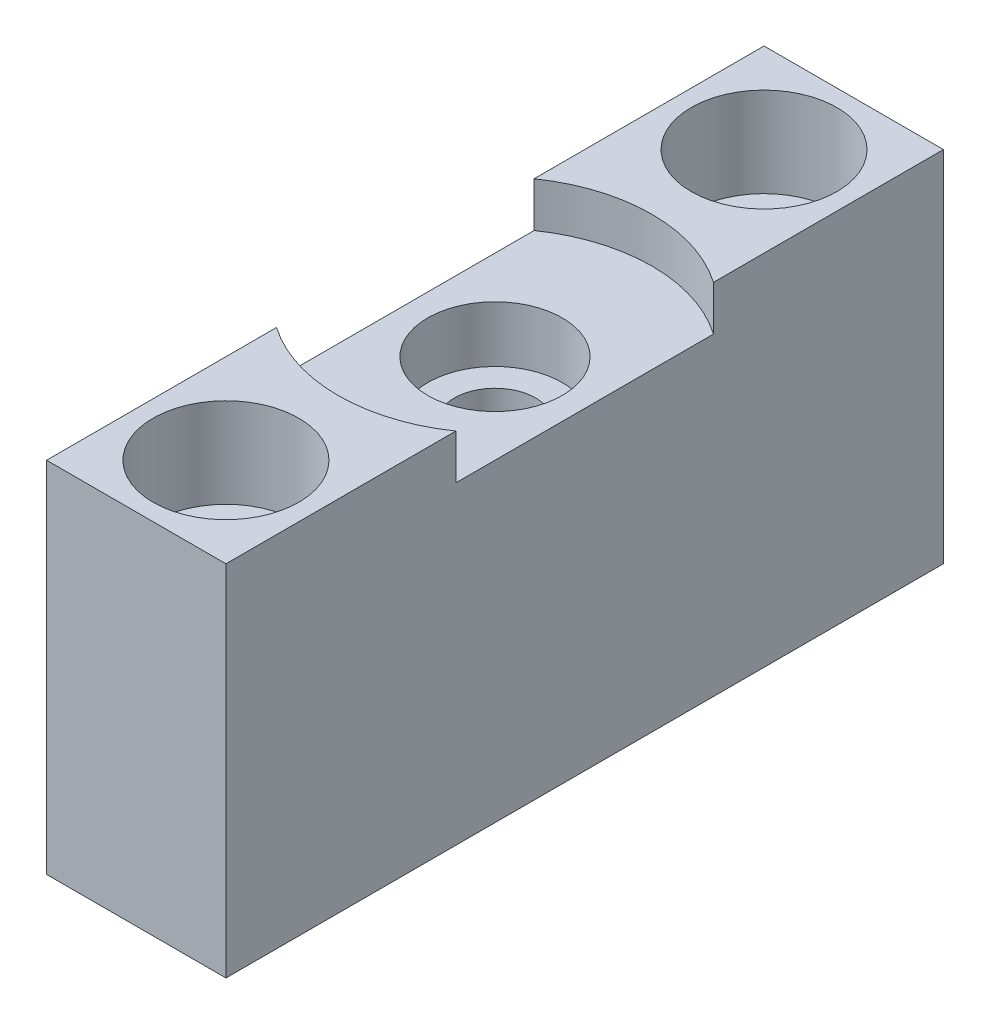
ISO-10303-21;
HEADER;
FILE_DESCRIPTION(('STEP AP214'),'2;1');
FILE_NAME('part.step','',(''),(''),'','','');
FILE_SCHEMA(('AUTOMOTIVE_DESIGN { 1 0 10303 214 1 1 1 1 }'));
ENDSEC;
DATA;
#1=APPLICATION_CONTEXT('core data for automotive mechanical design processes');
#2=APPLICATION_PROTOCOL_DEFINITION('international standard','automotive_design',2000,#1);
#3=PRODUCT_CONTEXT('',#1,'mechanical');
#4=PRODUCT('Part','Part','',(#3));
#5=PRODUCT_RELATED_PRODUCT_CATEGORY('part','',(#4));
#6=PRODUCT_DEFINITION_FORMATION('','',#4);
#7=PRODUCT_DEFINITION_CONTEXT('part definition',#1,'design');
#8=PRODUCT_DEFINITION('design','',#6,#7);
#9=PRODUCT_DEFINITION_SHAPE('','',#8);
#10=(LENGTH_UNIT() NAMED_UNIT(*) SI_UNIT(.MILLI.,.METRE.));
#11=(NAMED_UNIT(*) PLANE_ANGLE_UNIT() SI_UNIT($,.RADIAN.));
#12=(NAMED_UNIT(*) SI_UNIT($,.STERADIAN.) SOLID_ANGLE_UNIT());
#13=UNCERTAINTY_MEASURE_WITH_UNIT(LENGTH_MEASURE(1.E-05),#10,'distance_accuracy_value','');
#14=(GEOMETRIC_REPRESENTATION_CONTEXT(3) GLOBAL_UNCERTAINTY_ASSIGNED_CONTEXT((#13)) GLOBAL_UNIT_ASSIGNED_CONTEXT((#10,
#11,#12)) REPRESENTATION_CONTEXT('',''));
#15=CARTESIAN_POINT('',(0.,0.,0.));
#16=DIRECTION('',(0.,0.,1.));
#17=DIRECTION('',(1.,0.,0.));
#18=AXIS2_PLACEMENT_3D('',#15,#16,#17);
#19=CARTESIAN_POINT('',(25.4,50.8,0.));
#20=DIRECTION('',(0.,-1.,0.));
#21=DIRECTION('',(0.,0.,-1.));
#22=AXIS2_PLACEMENT_3D('',#19,#20,#21);
#23=PLANE('',#22);
#24=CARTESIAN_POINT('',(12.7,50.8,-12.7));
#25=DIRECTION('',(0.,1.,0.));
#26=DIRECTION('',(0.,0.,1.));
#27=AXIS2_PLACEMENT_3D('',#24,#25,#26);
#28=CIRCLE('',#27,10.31875);
#29=CARTESIAN_POINT('',(12.7,50.8,-2.38124999999999));
#30=VERTEX_POINT('',#29);
#31=EDGE_CURVE('E217',#30,#30,#28,.T.);
#32=ORIENTED_EDGE('',*,*,#31,.F.);
#33=EDGE_LOOP('',(#32));
#34=FACE_BOUND('',#33,.T.);
#35=DIRECTION('',(0.,0.,1.));
#36=VECTOR('',#35,1.);
#37=CARTESIAN_POINT('',(25.4,50.8,0.));
#38=LINE('',#37,#36);
#39=CARTESIAN_POINT('',(25.4,50.8,-32.5610135972417));
#40=VERTEX_POINT('',#39);
#41=CARTESIAN_POINT('',(25.4,50.8,0.));
#42=VERTEX_POINT('',#41);
#43=EDGE_CURVE('E59',#40,#42,#38,.T.);
#44=ORIENTED_EDGE('',*,*,#43,.F.);
#45=CARTESIAN_POINT('',(12.7,50.8,-50.8));
#46=DIRECTION('',(0.,1.,0.));
#47=DIRECTION('',(0.,0.,1.));
#48=AXIS2_PLACEMENT_3D('',#45,#46,#47);
#49=CIRCLE('',#48,22.225);
#50=CARTESIAN_POINT('',(0.,50.8,-32.5610135972417));
#51=VERTEX_POINT('',#50);
#52=EDGE_CURVE('E108',#51,#40,#49,.T.);
#53=ORIENTED_EDGE('',*,*,#52,.F.);
#54=DIRECTION('',(0.,0.,1.));
#55=VECTOR('',#54,1.);
#56=CARTESIAN_POINT('',(0.,50.8,0.));
#57=LINE('',#56,#55);
#58=CARTESIAN_POINT('',(0.,50.8,0.));
#59=VERTEX_POINT('',#58);
#60=EDGE_CURVE('E81',#51,#59,#57,.T.);
#61=ORIENTED_EDGE('',*,*,#60,.T.);
#62=DIRECTION('',(-1.,0.,0.));
#63=VECTOR('',#62,1.);
#64=CARTESIAN_POINT('',(25.4,50.8,0.));
#65=LINE('',#64,#63);
#66=EDGE_CURVE('E124',#42,#59,#65,.T.);
#67=ORIENTED_EDGE('',*,*,#66,.F.);
#68=EDGE_LOOP('',(#44,#53,#61,#67));
#69=FACE_BOUND('',#68,.T.);
#70=ADVANCED_FACE('F35',(#34,#69),#23,.F.);
#71=CARTESIAN_POINT('',(25.4,0.,0.));
#72=DIRECTION('',(0.,0.,-1.));
#73=DIRECTION('',(-1.,0.,0.));
#74=AXIS2_PLACEMENT_3D('',#71,#72,#73);
#75=PLANE('',#74);
#76=DIRECTION('',(0.,-1.,0.));
#77=VECTOR('',#76,1.);
#78=CARTESIAN_POINT('',(0.,0.,0.));
#79=LINE('',#78,#77);
#80=CARTESIAN_POINT('',(0.,0.,0.));
#81=VERTEX_POINT('',#80);
#82=EDGE_CURVE('E121',#59,#81,#79,.T.);
#83=ORIENTED_EDGE('',*,*,#82,.T.);
#84=DIRECTION('',(-1.,0.,0.));
#85=VECTOR('',#84,1.);
#86=CARTESIAN_POINT('',(25.4,0.,0.));
#87=LINE('',#86,#85);
#88=CARTESIAN_POINT('',(25.4,0.,0.));
#89=VERTEX_POINT('',#88);
#90=EDGE_CURVE('E150',#89,#81,#87,.T.);
#91=ORIENTED_EDGE('',*,*,#90,.F.);
#92=DIRECTION('',(0.,-1.,0.));
#93=VECTOR('',#92,1.);
#94=CARTESIAN_POINT('',(25.4,0.,0.));
#95=LINE('',#94,#93);
#96=EDGE_CURVE('E142',#42,#89,#95,.T.);
#97=ORIENTED_EDGE('',*,*,#96,.F.);
#98=ORIENTED_EDGE('',*,*,#66,.T.);
#99=EDGE_LOOP('',(#83,#91,#97,#98));
#100=FACE_BOUND('',#99,.T.);
#101=ADVANCED_FACE('F37',(#100),#75,.F.);
#102=CARTESIAN_POINT('',(25.4,0.,0.));
#103=DIRECTION('',(0.,1.,0.));
#104=DIRECTION('',(0.,0.,1.));
#105=AXIS2_PLACEMENT_3D('',#102,#103,#104);
#106=PLANE('',#105);
#107=CARTESIAN_POINT('',(12.7,0.,-88.9));
#108=DIRECTION('',(0.,1.,0.));
#109=DIRECTION('',(0.,0.,1.));
#110=AXIS2_PLACEMENT_3D('',#107,#108,#109);
#111=CIRCLE('',#110,6.74624000000007);
#112=CARTESIAN_POINT('',(12.7,0.,-82.1537599999999));
#113=VERTEX_POINT('',#112);
#114=EDGE_CURVE('E214',#113,#113,#111,.T.);
#115=ORIENTED_EDGE('',*,*,#114,.T.);
#116=EDGE_LOOP('',(#115));
#117=FACE_BOUND('',#116,.T.);
#118=CARTESIAN_POINT('',(12.7,0.,-12.7));
#119=DIRECTION('',(0.,1.,0.));
#120=DIRECTION('',(0.,0.,1.));
#121=AXIS2_PLACEMENT_3D('',#118,#119,#120);
#122=CIRCLE('',#121,6.74624000000007);
#123=CARTESIAN_POINT('',(12.7,0.,-5.95375999999992));
#124=VERTEX_POINT('',#123);
#125=EDGE_CURVE('E226',#124,#124,#122,.T.);
#126=ORIENTED_EDGE('',*,*,#125,.T.);
#127=EDGE_LOOP('',(#126));
#128=FACE_BOUND('',#127,.T.);
#129=CARTESIAN_POINT('',(12.7,0.,-50.8));
#130=DIRECTION('',(0.,1.,0.));
#131=DIRECTION('',(0.,0.,1.));
#132=AXIS2_PLACEMENT_3D('',#129,#130,#131);
#133=CIRCLE('',#132,5.7543699999999);
#134=CARTESIAN_POINT('',(12.7,0.,-45.0456300000001));
#135=VERTEX_POINT('',#134);
#136=EDGE_CURVE('E232',#135,#135,#133,.T.);
#137=ORIENTED_EDGE('',*,*,#136,.T.);
#138=EDGE_LOOP('',(#137));
#139=FACE_BOUND('',#138,.T.);
#140=DIRECTION('',(0.,0.,-1.));
#141=VECTOR('',#140,1.);
#142=CARTESIAN_POINT('',(0.,0.,0.));
#143=LINE('',#142,#141);
#144=CARTESIAN_POINT('',(0.,0.,-101.6));
#145=VERTEX_POINT('',#144);
#146=EDGE_CURVE('E135',#81,#145,#143,.T.);
#147=ORIENTED_EDGE('',*,*,#146,.T.);
#148=DIRECTION('',(-1.,0.,0.));
#149=VECTOR('',#148,1.);
#150=CARTESIAN_POINT('',(25.4,0.,-101.6));
#151=LINE('',#150,#149);
#152=CARTESIAN_POINT('',(25.4,0.,-101.6));
#153=VERTEX_POINT('',#152);
#154=EDGE_CURVE('E147',#153,#145,#151,.T.);
#155=ORIENTED_EDGE('',*,*,#154,.F.);
#156=DIRECTION('',(0.,0.,-1.));
#157=VECTOR('',#156,1.);
#158=CARTESIAN_POINT('',(25.4,0.,0.));
#159=LINE('',#158,#157);
#160=EDGE_CURVE('E89',#89,#153,#159,.T.);
#161=ORIENTED_EDGE('',*,*,#160,.F.);
#162=ORIENTED_EDGE('',*,*,#90,.T.);
#163=EDGE_LOOP('',(#147,#155,#161,#162));
#164=FACE_BOUND('',#163,.T.);
#165=ADVANCED_FACE('F173',(#117,#128,#139,#164),#106,.F.);
#166=CARTESIAN_POINT('',(25.4,0.,-101.6));
#167=DIRECTION('',(0.,0.,1.));
#168=DIRECTION('',(1.,0.,0.));
#169=AXIS2_PLACEMENT_3D('',#166,#167,#168);
#170=PLANE('',#169);
#171=DIRECTION('',(0.,1.,0.));
#172=VECTOR('',#171,1.);
#173=CARTESIAN_POINT('',(0.,0.,-101.6));
#174=LINE('',#173,#172);
#175=CARTESIAN_POINT('',(0.,50.8,-101.6));
#176=VERTEX_POINT('',#175);
#177=EDGE_CURVE('E137',#145,#176,#174,.T.);
#178=ORIENTED_EDGE('',*,*,#177,.T.);
#179=DIRECTION('',(-1.,0.,0.));
#180=VECTOR('',#179,1.);
#181=CARTESIAN_POINT('',(25.4,50.8,-101.6));
#182=LINE('',#181,#180);
#183=CARTESIAN_POINT('',(25.4,50.8,-101.6));
#184=VERTEX_POINT('',#183);
#185=EDGE_CURVE('E144',#184,#176,#182,.T.);
#186=ORIENTED_EDGE('',*,*,#185,.F.);
#187=DIRECTION('',(0.,1.,0.));
#188=VECTOR('',#187,1.);
#189=CARTESIAN_POINT('',(25.4,0.,-101.6));
#190=LINE('',#189,#188);
#191=EDGE_CURVE('E127',#153,#184,#190,.T.);
#192=ORIENTED_EDGE('',*,*,#191,.F.);
#193=ORIENTED_EDGE('',*,*,#154,.T.);
#194=EDGE_LOOP('',(#178,#186,#192,#193));
#195=FACE_BOUND('',#194,.T.);
#196=ADVANCED_FACE('F176',(#195),#170,.F.);
#197=CARTESIAN_POINT('',(12.7,50.8,-88.9));
#198=DIRECTION('',(0.,1.,0.));
#199=DIRECTION('',(0.,0.,1.));
#200=AXIS2_PLACEMENT_3D('',#197,#198,#199);
#201=CIRCLE('',#200,10.31875);
#202=CARTESIAN_POINT('',(12.7,50.8,-78.58125));
#203=VERTEX_POINT('',#202);
#204=EDGE_CURVE('E204',#203,#203,#201,.T.);
#205=ORIENTED_EDGE('',*,*,#204,.F.);
#206=EDGE_LOOP('',(#205));
#207=FACE_BOUND('',#206,.T.);
#208=CARTESIAN_POINT('',(0.,50.8,-69.0389864027582));
#209=VERTEX_POINT('',#208);
#210=EDGE_CURVE('E139',#176,#209,#57,.T.);
#211=ORIENTED_EDGE('',*,*,#210,.T.);
#212=CARTESIAN_POINT('',(25.4,50.8,-69.0389864027582));
#213=VERTEX_POINT('',#212);
#214=EDGE_CURVE('E114',#213,#209,#49,.T.);
#215=ORIENTED_EDGE('',*,*,#214,.F.);
#216=EDGE_CURVE('E126',#184,#213,#38,.T.);
#217=ORIENTED_EDGE('',*,*,#216,.F.);
#218=ORIENTED_EDGE('',*,*,#185,.T.);
#219=EDGE_LOOP('',(#211,#215,#217,#218));
#220=FACE_BOUND('',#219,.T.);
#221=ADVANCED_FACE('F179',(#207,#220),#23,.F.);
#222=CARTESIAN_POINT('',(25.4,0.,0.));
#223=DIRECTION('',(-1.,0.,0.));
#224=DIRECTION('',(0.,0.,1.));
#225=AXIS2_PLACEMENT_3D('',#222,#223,#224);
#226=PLANE('',#225);
#227=DIRECTION('',(0.,0.,-1.));
#228=VECTOR('',#227,1.);
#229=CARTESIAN_POINT('',(25.4,44.45,0.));
#230=LINE('',#229,#228);
#231=CARTESIAN_POINT('',(25.4,44.45,-32.5610135972417));
#232=VERTEX_POINT('',#231);
#233=CARTESIAN_POINT('',(25.4,44.45,-69.0389864027582));
#234=VERTEX_POINT('',#233);
#235=EDGE_CURVE('E120',#232,#234,#230,.T.);
#236=ORIENTED_EDGE('',*,*,#235,.F.);
#237=DIRECTION('',(0.,1.,0.));
#238=VECTOR('',#237,1.);
#239=CARTESIAN_POINT('',(25.4,44.45,-32.5610135972417));
#240=LINE('',#239,#238);
#241=EDGE_CURVE('E111',#232,#40,#240,.T.);
#242=ORIENTED_EDGE('',*,*,#241,.T.);
#243=ORIENTED_EDGE('',*,*,#43,.T.);
#244=ORIENTED_EDGE('',*,*,#96,.T.);
#245=ORIENTED_EDGE('',*,*,#160,.T.);
#246=ORIENTED_EDGE('',*,*,#191,.T.);
#247=ORIENTED_EDGE('',*,*,#216,.T.);
#248=DIRECTION('',(0.,1.,0.));
#249=VECTOR('',#248,1.);
#250=CARTESIAN_POINT('',(25.4,44.45,-69.0389864027582));
#251=LINE('',#250,#249);
#252=EDGE_CURVE('E122',#213,#234,#251,.F.);
#253=ORIENTED_EDGE('',*,*,#252,.T.);
#254=EDGE_LOOP('',(#236,#242,#243,#244,#245,#246,#247,#253));
#255=FACE_BOUND('',#254,.T.);
#256=ADVANCED_FACE('F118',(#255),#226,.F.);
#257=CARTESIAN_POINT('',(0.,0.,0.));
#258=DIRECTION('',(-1.,0.,0.));
#259=DIRECTION('',(0.,0.,1.));
#260=AXIS2_PLACEMENT_3D('',#257,#258,#259);
#261=PLANE('',#260);
#262=DIRECTION('',(0.,1.,0.));
#263=VECTOR('',#262,1.);
#264=CARTESIAN_POINT('',(0.,44.45,-32.5610135972417));
#265=LINE('',#264,#263);
#266=CARTESIAN_POINT('',(0.,44.45,-32.5610135972417));
#267=VERTEX_POINT('',#266);
#268=EDGE_CURVE('E11',#267,#51,#265,.T.);
#269=ORIENTED_EDGE('',*,*,#268,.F.);
#270=DIRECTION('',(0.,0.,-1.));
#271=VECTOR('',#270,1.);
#272=CARTESIAN_POINT('',(0.,44.45,0.));
#273=LINE('',#272,#271);
#274=CARTESIAN_POINT('',(0.,44.45,-69.0389864027582));
#275=VERTEX_POINT('',#274);
#276=EDGE_CURVE('E152',#267,#275,#273,.T.);
#277=ORIENTED_EDGE('',*,*,#276,.T.);
#278=DIRECTION('',(0.,1.,0.));
#279=VECTOR('',#278,1.);
#280=CARTESIAN_POINT('',(0.,44.45,-69.0389864027582));
#281=LINE('',#280,#279);
#282=EDGE_CURVE('E43',#209,#275,#281,.F.);
#283=ORIENTED_EDGE('',*,*,#282,.F.);
#284=ORIENTED_EDGE('',*,*,#210,.F.);
#285=ORIENTED_EDGE('',*,*,#177,.F.);
#286=ORIENTED_EDGE('',*,*,#146,.F.);
#287=ORIENTED_EDGE('',*,*,#82,.F.);
#288=ORIENTED_EDGE('',*,*,#60,.F.);
#289=EDGE_LOOP('',(#269,#277,#283,#284,#285,#286,#287,#288));
#290=FACE_BOUND('',#289,.T.);
#291=ADVANCED_FACE('F160',(#290),#261,.T.);
#292=CARTESIAN_POINT('',(12.7,44.45,-50.8));
#293=DIRECTION('',(0.,1.,0.));
#294=DIRECTION('',(0.,0.,1.));
#295=AXIS2_PLACEMENT_3D('',#292,#293,#294);
#296=CYLINDRICAL_SURFACE('',#295,22.225);
#297=CARTESIAN_POINT('',(12.7,44.45,-50.8));
#298=DIRECTION('',(0.,1.,0.));
#299=DIRECTION('',(0.,0.,1.));
#300=AXIS2_PLACEMENT_3D('',#297,#298,#299);
#301=CIRCLE('',#300,22.225);
#302=EDGE_CURVE('E162',#267,#232,#301,.T.);
#303=ORIENTED_EDGE('',*,*,#302,.F.);
#304=ORIENTED_EDGE('',*,*,#268,.T.);
#305=ORIENTED_EDGE('',*,*,#52,.T.);
#306=ORIENTED_EDGE('',*,*,#241,.F.);
#307=EDGE_LOOP('',(#303,#304,#305,#306));
#308=FACE_BOUND('',#307,.T.);
#309=ADVANCED_FACE('F110',(#308),#296,.F.);
#310=ORIENTED_EDGE('',*,*,#214,.T.);
#311=ORIENTED_EDGE('',*,*,#282,.T.);
#312=EDGE_CURVE('E50',#234,#275,#301,.T.);
#313=ORIENTED_EDGE('',*,*,#312,.F.);
#314=ORIENTED_EDGE('',*,*,#252,.F.);
#315=EDGE_LOOP('',(#310,#311,#313,#314));
#316=FACE_BOUND('',#315,.T.);
#317=ADVANCED_FACE('F156',(#316),#296,.F.);
#318=CARTESIAN_POINT('',(12.7,44.45,-50.8));
#319=DIRECTION('',(0.,1.,0.));
#320=DIRECTION('',(0.,0.,1.));
#321=AXIS2_PLACEMENT_3D('',#318,#319,#320);
#322=PLANE('',#321);
#323=CARTESIAN_POINT('',(12.7,44.45,-50.8));
#324=DIRECTION('',(0.,1.,0.));
#325=DIRECTION('',(0.,0.,1.));
#326=AXIS2_PLACEMENT_3D('',#323,#324,#325);
#327=CIRCLE('',#326,9.525);
#328=CARTESIAN_POINT('',(12.7,44.45,-41.275));
#329=VERTEX_POINT('',#328);
#330=EDGE_CURVE('E165',#329,#329,#327,.T.);
#331=ORIENTED_EDGE('',*,*,#330,.F.);
#332=EDGE_LOOP('',(#331));
#333=FACE_BOUND('',#332,.T.);
#334=ORIENTED_EDGE('',*,*,#235,.T.);
#335=ORIENTED_EDGE('',*,*,#312,.T.);
#336=ORIENTED_EDGE('',*,*,#276,.F.);
#337=ORIENTED_EDGE('',*,*,#302,.T.);
#338=EDGE_LOOP('',(#334,#335,#336,#337));
#339=FACE_BOUND('',#338,.T.);
#340=ADVANCED_FACE('F161',(#333,#339),#322,.T.);
#341=CARTESIAN_POINT('',(12.7,36.5125,-50.8));
#342=DIRECTION('',(0.,1.,0.));
#343=DIRECTION('',(0.,0.,1.));
#344=AXIS2_PLACEMENT_3D('',#341,#342,#343);
#345=CYLINDRICAL_SURFACE('',#344,9.525);
#346=CARTESIAN_POINT('',(12.7,36.5125,-50.8));
#347=DIRECTION('',(0.,1.,0.));
#348=DIRECTION('',(0.,0.,1.));
#349=AXIS2_PLACEMENT_3D('',#346,#347,#348);
#350=CIRCLE('',#349,9.525);
#351=CARTESIAN_POINT('',(12.7,36.5125,-41.275));
#352=VERTEX_POINT('',#351);
#353=EDGE_CURVE('E115',#352,#352,#350,.T.);
#354=ORIENTED_EDGE('',*,*,#353,.F.);
#355=EDGE_LOOP('',(#354));
#356=FACE_BOUND('',#355,.T.);
#357=ORIENTED_EDGE('',*,*,#330,.T.);
#358=EDGE_LOOP('',(#357));
#359=FACE_BOUND('',#358,.T.);
#360=ADVANCED_FACE('F240',(#356,#359),#345,.F.);
#361=CARTESIAN_POINT('',(12.7,36.5125,-50.8));
#362=DIRECTION('',(0.,1.,0.));
#363=DIRECTION('',(0.,0.,1.));
#364=AXIS2_PLACEMENT_3D('',#361,#362,#363);
#365=PLANE('',#364);
#366=CARTESIAN_POINT('',(12.7,36.5125,-50.8));
#367=DIRECTION('',(0.,1.,0.));
#368=DIRECTION('',(0.,0.,1.));
#369=AXIS2_PLACEMENT_3D('',#366,#367,#368);
#370=CIRCLE('',#369,5.75436999999991);
#371=CARTESIAN_POINT('',(12.7,36.5125,-45.0456300000001));
#372=VERTEX_POINT('',#371);
#373=EDGE_CURVE('E229',#372,#372,#370,.T.);
#374=ORIENTED_EDGE('',*,*,#373,.F.);
#375=EDGE_LOOP('',(#374));
#376=FACE_BOUND('',#375,.T.);
#377=ORIENTED_EDGE('',*,*,#353,.T.);
#378=EDGE_LOOP('',(#377));
#379=FACE_BOUND('',#378,.T.);
#380=ADVANCED_FACE('F248',(#376,#379),#365,.T.);
#381=CARTESIAN_POINT('',(12.7,36.5125,-50.8));
#382=DIRECTION('',(0.,1.,0.));
#383=DIRECTION('',(0.,0.,1.));
#384=AXIS2_PLACEMENT_3D('',#381,#382,#383);
#385=CYLINDRICAL_SURFACE('',#384,5.7543699999999);
#386=ORIENTED_EDGE('',*,*,#136,.F.);
#387=EDGE_LOOP('',(#386));
#388=FACE_BOUND('',#387,.T.);
#389=ORIENTED_EDGE('',*,*,#373,.T.);
#390=EDGE_LOOP('',(#389));
#391=FACE_BOUND('',#390,.T.);
#392=ADVANCED_FACE('F286',(#388,#391),#385,.F.);
#393=CARTESIAN_POINT('',(12.7,50.8,-12.7));
#394=DIRECTION('',(0.,1.,0.));
#395=DIRECTION('',(0.,0.,1.));
#396=AXIS2_PLACEMENT_3D('',#393,#394,#395);
#397=CYLINDRICAL_SURFACE('',#396,6.74624000000008);
#398=ORIENTED_EDGE('',*,*,#125,.F.);
#399=EDGE_LOOP('',(#398));
#400=FACE_BOUND('',#399,.T.);
#401=CARTESIAN_POINT('',(12.7,38.1,-12.7));
#402=DIRECTION('',(0.,1.,0.));
#403=DIRECTION('',(0.,0.,1.));
#404=AXIS2_PLACEMENT_3D('',#401,#402,#403);
#405=CIRCLE('',#404,6.74624000000009);
#406=CARTESIAN_POINT('',(12.7,38.1,-5.95375999999991));
#407=VERTEX_POINT('',#406);
#408=EDGE_CURVE('E223',#407,#407,#405,.T.);
#409=ORIENTED_EDGE('',*,*,#408,.T.);
#410=EDGE_LOOP('',(#409));
#411=FACE_BOUND('',#410,.T.);
#412=ADVANCED_FACE('F295',(#400,#411),#397,.F.);
#413=CARTESIAN_POINT('',(19.4462400000001,38.1,-12.7));
#414=DIRECTION('',(0.,-1.,0.));
#415=DIRECTION('',(0.,0.,-1.));
#416=AXIS2_PLACEMENT_3D('',#413,#414,#415);
#417=PLANE('',#416);
#418=ORIENTED_EDGE('',*,*,#408,.F.);
#419=EDGE_LOOP('',(#418));
#420=FACE_BOUND('',#419,.T.);
#421=CARTESIAN_POINT('',(12.7,38.1,-12.7));
#422=DIRECTION('',(0.,1.,0.));
#423=DIRECTION('',(0.,0.,1.));
#424=AXIS2_PLACEMENT_3D('',#421,#422,#423);
#425=CIRCLE('',#424,10.31875);
#426=CARTESIAN_POINT('',(12.7,38.1,-2.38125));
#427=VERTEX_POINT('',#426);
#428=EDGE_CURVE('E220',#427,#427,#425,.T.);
#429=ORIENTED_EDGE('',*,*,#428,.T.);
#430=EDGE_LOOP('',(#429));
#431=FACE_BOUND('',#430,.T.);
#432=ADVANCED_FACE('F323',(#420,#431),#417,.F.);
#433=CARTESIAN_POINT('',(12.7,50.8,-12.7));
#434=DIRECTION('',(0.,1.,0.));
#435=DIRECTION('',(0.,0.,1.));
#436=AXIS2_PLACEMENT_3D('',#433,#434,#435);
#437=CYLINDRICAL_SURFACE('',#436,10.31875);
#438=ORIENTED_EDGE('',*,*,#428,.F.);
#439=EDGE_LOOP('',(#438));
#440=FACE_BOUND('',#439,.T.);
#441=ORIENTED_EDGE('',*,*,#31,.T.);
#442=EDGE_LOOP('',(#441));
#443=FACE_BOUND('',#442,.T.);
#444=ADVANCED_FACE('F333',(#440,#443),#437,.F.);
#445=CARTESIAN_POINT('',(12.7,50.8,-88.9));
#446=DIRECTION('',(0.,1.,0.));
#447=DIRECTION('',(0.,0.,1.));
#448=AXIS2_PLACEMENT_3D('',#445,#446,#447);
#449=CYLINDRICAL_SURFACE('',#448,6.74624000000008);
#450=ORIENTED_EDGE('',*,*,#114,.F.);
#451=EDGE_LOOP('',(#450));
#452=FACE_BOUND('',#451,.T.);
#453=CARTESIAN_POINT('',(12.7,38.1,-88.9));
#454=DIRECTION('',(0.,1.,0.));
#455=DIRECTION('',(0.,0.,1.));
#456=AXIS2_PLACEMENT_3D('',#453,#454,#455);
#457=CIRCLE('',#456,6.74624000000009);
#458=CARTESIAN_POINT('',(12.7,38.1,-82.1537599999999));
#459=VERTEX_POINT('',#458);
#460=EDGE_CURVE('E209',#459,#459,#457,.T.);
#461=ORIENTED_EDGE('',*,*,#460,.T.);
#462=EDGE_LOOP('',(#461));
#463=FACE_BOUND('',#462,.T.);
#464=ADVANCED_FACE('F343',(#452,#463),#449,.F.);
#465=CARTESIAN_POINT('',(19.4462400000001,38.1,-88.9));
#466=DIRECTION('',(0.,-1.,0.));
#467=DIRECTION('',(0.,0.,-1.));
#468=AXIS2_PLACEMENT_3D('',#465,#466,#467);
#469=PLANE('',#468);
#470=ORIENTED_EDGE('',*,*,#460,.F.);
#471=EDGE_LOOP('',(#470));
#472=FACE_BOUND('',#471,.T.);
#473=CARTESIAN_POINT('',(12.7,38.1,-88.9));
#474=DIRECTION('',(0.,1.,0.));
#475=DIRECTION('',(0.,0.,1.));
#476=AXIS2_PLACEMENT_3D('',#473,#474,#475);
#477=CIRCLE('',#476,10.31875);
#478=CARTESIAN_POINT('',(12.7,38.1,-78.58125));
#479=VERTEX_POINT('',#478);
#480=EDGE_CURVE('E206',#479,#479,#477,.T.);
#481=ORIENTED_EDGE('',*,*,#480,.T.);
#482=EDGE_LOOP('',(#481));
#483=FACE_BOUND('',#482,.T.);
#484=ADVANCED_FACE('F353',(#472,#483),#469,.F.);
#485=CARTESIAN_POINT('',(12.7,50.8,-88.9));
#486=DIRECTION('',(0.,1.,0.));
#487=DIRECTION('',(0.,0.,1.));
#488=AXIS2_PLACEMENT_3D('',#485,#486,#487);
#489=CYLINDRICAL_SURFACE('',#488,10.31875);
#490=ORIENTED_EDGE('',*,*,#480,.F.);
#491=EDGE_LOOP('',(#490));
#492=FACE_BOUND('',#491,.T.);
#493=ORIENTED_EDGE('',*,*,#204,.T.);
#494=EDGE_LOOP('',(#493));
#495=FACE_BOUND('',#494,.T.);
#496=ADVANCED_FACE('F363',(#492,#495),#489,.F.);
#497=CLOSED_SHELL('',(#70,#101,#165,#196,#221,#256,#291,#309,#317,#340,#360,#380,#392,#412,#432,
#444,#464,#484,#496));
#498=MANIFOLD_SOLID_BREP('B2',#497);
#499=ADVANCED_BREP_SHAPE_REPRESENTATION('',(#18,#498),#14);
#500=SHAPE_DEFINITION_REPRESENTATION(#9,#499);
ENDSEC;
END-ISO-10303-21;
